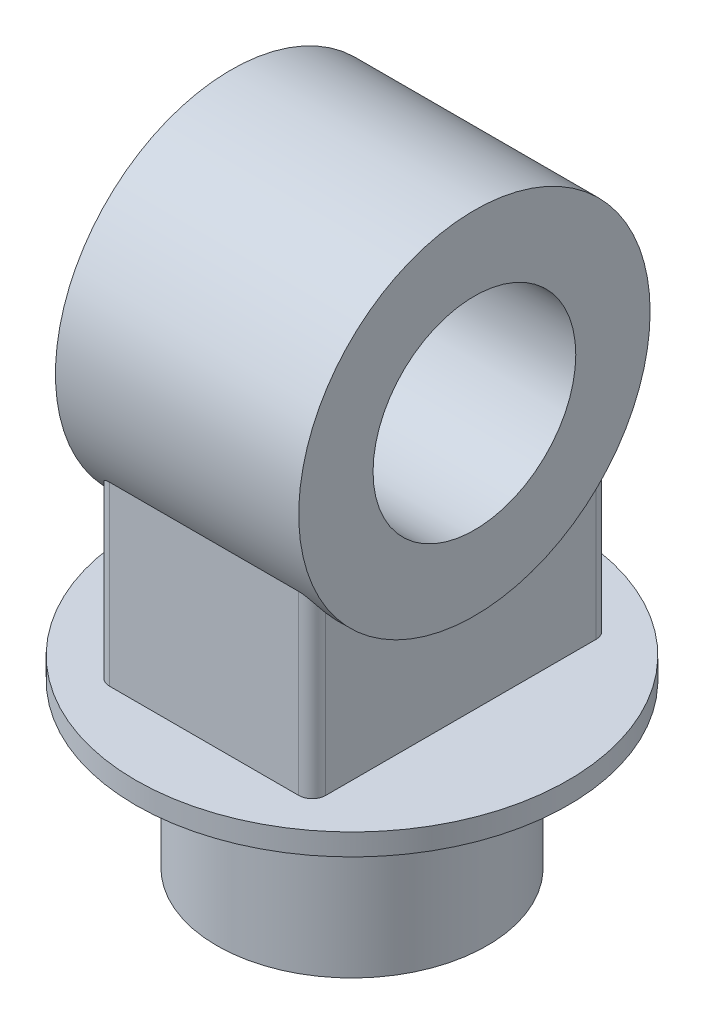
ISO-10303-21;
HEADER;
FILE_DESCRIPTION(('STEP AP214'),'2;1');
FILE_NAME('part.step','',(''),(''),'','','');
FILE_SCHEMA(('AUTOMOTIVE_DESIGN { 1 0 10303 214 1 1 1 1 }'));
ENDSEC;
DATA;
#1=APPLICATION_CONTEXT('core data for automotive mechanical design processes');
#2=APPLICATION_PROTOCOL_DEFINITION('international standard','automotive_design',2000,#1);
#3=PRODUCT_CONTEXT('',#1,'mechanical');
#4=PRODUCT('Part','Part','',(#3));
#5=PRODUCT_RELATED_PRODUCT_CATEGORY('part','',(#4));
#6=PRODUCT_DEFINITION_FORMATION('','',#4);
#7=PRODUCT_DEFINITION_CONTEXT('part definition',#1,'design');
#8=PRODUCT_DEFINITION('design','',#6,#7);
#9=PRODUCT_DEFINITION_SHAPE('','',#8);
#10=(LENGTH_UNIT() NAMED_UNIT(*) SI_UNIT(.MILLI.,.METRE.));
#11=(NAMED_UNIT(*) PLANE_ANGLE_UNIT() SI_UNIT($,.RADIAN.));
#12=(NAMED_UNIT(*) SI_UNIT($,.STERADIAN.) SOLID_ANGLE_UNIT());
#13=UNCERTAINTY_MEASURE_WITH_UNIT(LENGTH_MEASURE(1.E-05),#10,'distance_accuracy_value','');
#14=(GEOMETRIC_REPRESENTATION_CONTEXT(3) GLOBAL_UNCERTAINTY_ASSIGNED_CONTEXT((#13)) GLOBAL_UNIT_ASSIGNED_CONTEXT((#10,
#11,#12)) REPRESENTATION_CONTEXT('',''));
#15=CARTESIAN_POINT('',(0.,0.,0.));
#16=DIRECTION('',(0.,0.,1.));
#17=DIRECTION('',(1.,0.,0.));
#18=AXIS2_PLACEMENT_3D('',#15,#16,#17);
#19=CARTESIAN_POINT('',(80.,216.,-110.576839132589));
#20=DIRECTION('',(0.,0.,1.));
#21=DIRECTION('',(0.,-1.,0.));
#22=AXIS2_PLACEMENT_3D('',#19,#20,#21);
#23=PLANE('',#22);
#24=DIRECTION('',(-1.,0.,0.));
#25=VECTOR('',#24,1.);
#26=CARTESIAN_POINT('',(80.,16.,-110.576839132589));
#27=LINE('',#26,#25);
#28=CARTESIAN_POINT('',(70.,16.,-110.576839132589));
#29=VERTEX_POINT('',#28);
#30=CARTESIAN_POINT('',(-70.,16.,-110.576839132589));
#31=VERTEX_POINT('',#30);
#32=EDGE_CURVE('E205',#29,#31,#27,.T.);
#33=ORIENTED_EDGE('',*,*,#32,.T.);
#34=DIRECTION('',(0.,1.,0.));
#35=VECTOR('',#34,1.);
#36=CARTESIAN_POINT('',(-70.,216.,-110.576839132589));
#37=LINE('',#36,#35);
#38=CARTESIAN_POINT('',(-70.,146.717967697245,-110.576839132589));
#39=VERTEX_POINT('',#38);
#40=EDGE_CURVE('E129',#31,#39,#37,.T.);
#41=ORIENTED_EDGE('',*,*,#40,.T.);
#42=DIRECTION('',(-1.,0.,0.));
#43=VECTOR('',#42,1.);
#44=CARTESIAN_POINT('',(90.,146.717967697245,-110.576839132589));
#45=LINE('',#44,#43);
#46=CARTESIAN_POINT('',(70.,146.717967697245,-110.576839132589));
#47=VERTEX_POINT('',#46);
#48=EDGE_CURVE('E113',#47,#39,#45,.T.);
#49=ORIENTED_EDGE('',*,*,#48,.F.);
#50=DIRECTION('',(0.,1.,0.));
#51=VECTOR('',#50,1.);
#52=CARTESIAN_POINT('',(70.,16.,-110.576839132589));
#53=LINE('',#52,#51);
#54=EDGE_CURVE('E130',#47,#29,#53,.F.);
#55=ORIENTED_EDGE('',*,*,#54,.T.);
#56=EDGE_LOOP('',(#33,#41,#49,#55));
#57=FACE_BOUND('',#56,.T.);
#58=ADVANCED_FACE('F39',(#57),#23,.F.);
#59=CARTESIAN_POINT('',(80.,216.,109.423160867411));
#60=DIRECTION('',(0.,0.,-1.));
#61=DIRECTION('',(0.,1.,0.));
#62=AXIS2_PLACEMENT_3D('',#59,#60,#61);
#63=PLANE('',#62);
#64=DIRECTION('',(-1.,0.,0.));
#65=VECTOR('',#64,1.);
#66=CARTESIAN_POINT('',(90.,146.717967697245,109.423160867411));
#67=LINE('',#66,#65);
#68=CARTESIAN_POINT('',(-70.,146.717967697245,109.423160867411));
#69=VERTEX_POINT('',#68);
#70=CARTESIAN_POINT('',(70.,146.717967697245,109.423160867411));
#71=VERTEX_POINT('',#70);
#72=EDGE_CURVE('E128',#69,#71,#67,.F.);
#73=ORIENTED_EDGE('',*,*,#72,.F.);
#74=DIRECTION('',(0.,-1.,0.));
#75=VECTOR('',#74,1.);
#76=CARTESIAN_POINT('',(-70.,216.,109.423160867411));
#77=LINE('',#76,#75);
#78=CARTESIAN_POINT('',(-70.,16.,109.423160867411));
#79=VERTEX_POINT('',#78);
#80=EDGE_CURVE('E150',#69,#79,#77,.T.);
#81=ORIENTED_EDGE('',*,*,#80,.T.);
#82=DIRECTION('',(-1.,0.,0.));
#83=VECTOR('',#82,1.);
#84=CARTESIAN_POINT('',(80.,16.,109.423160867411));
#85=LINE('',#84,#83);
#86=CARTESIAN_POINT('',(70.,16.,109.423160867411));
#87=VERTEX_POINT('',#86);
#88=EDGE_CURVE('E193',#87,#79,#85,.T.);
#89=ORIENTED_EDGE('',*,*,#88,.F.);
#90=DIRECTION('',(0.,-1.,0.));
#91=VECTOR('',#90,1.);
#92=CARTESIAN_POINT('',(70.,146.717967697245,109.423160867411));
#93=LINE('',#92,#91);
#94=EDGE_CURVE('E144',#87,#71,#93,.F.);
#95=ORIENTED_EDGE('',*,*,#94,.T.);
#96=EDGE_LOOP('',(#73,#81,#89,#95));
#97=FACE_BOUND('',#96,.T.);
#98=ADVANCED_FACE('F196',(#97),#63,.F.);
#99=CARTESIAN_POINT('',(0.,16.,0.));
#100=DIRECTION('',(0.,1.,0.));
#101=DIRECTION('',(0.,0.,1.));
#102=AXIS2_PLACEMENT_3D('',#99,#100,#101);
#103=PLANE('',#102);
#104=CARTESIAN_POINT('',(0.,16.,0.));
#105=DIRECTION('',(0.,1.,0.));
#106=DIRECTION('',(0.,0.,1.));
#107=AXIS2_PLACEMENT_3D('',#104,#105,#106);
#108=CIRCLE('',#107,160.);
#109=CARTESIAN_POINT('',(0.,16.,160.));
#110=VERTEX_POINT('',#109);
#111=EDGE_CURVE('E214',#110,#110,#108,.T.);
#112=ORIENTED_EDGE('',*,*,#111,.T.);
#113=EDGE_LOOP('',(#112));
#114=FACE_BOUND('',#113,.T.);
#115=DIRECTION('',(0.,0.,-1.));
#116=VECTOR('',#115,1.);
#117=CARTESIAN_POINT('',(80.,16.,109.423160867411));
#118=LINE('',#117,#116);
#119=CARTESIAN_POINT('',(80.,16.,99.4231608674106));
#120=VERTEX_POINT('',#119);
#121=CARTESIAN_POINT('',(80.,16.,-100.576839132589));
#122=VERTEX_POINT('',#121);
#123=EDGE_CURVE('E194',#120,#122,#118,.T.);
#124=ORIENTED_EDGE('',*,*,#123,.F.);
#125=CARTESIAN_POINT('',(70.,16.,99.4231608674106));
#126=DIRECTION('',(0.,1.,0.));
#127=DIRECTION('',(0.,0.,1.));
#128=AXIS2_PLACEMENT_3D('',#125,#126,#127);
#129=CIRCLE('',#128,10.);
#130=EDGE_CURVE('E52',#120,#87,#129,.F.);
#131=ORIENTED_EDGE('',*,*,#130,.T.);
#132=ORIENTED_EDGE('',*,*,#88,.T.);
#133=CARTESIAN_POINT('',(-70.,16.,99.4231608674106));
#134=DIRECTION('',(0.,1.,0.));
#135=DIRECTION('',(0.,0.,1.));
#136=AXIS2_PLACEMENT_3D('',#133,#134,#135);
#137=CIRCLE('',#136,10.);
#138=CARTESIAN_POINT('',(-80.,16.,99.4231608674106));
#139=VERTEX_POINT('',#138);
#140=EDGE_CURVE('E183',#79,#139,#137,.F.);
#141=ORIENTED_EDGE('',*,*,#140,.T.);
#142=DIRECTION('',(0.,0.,-1.));
#143=VECTOR('',#142,1.);
#144=CARTESIAN_POINT('',(-80.,16.,109.423160867411));
#145=LINE('',#144,#143);
#146=CARTESIAN_POINT('',(-80.,16.,-100.576839132589));
#147=VERTEX_POINT('',#146);
#148=EDGE_CURVE('E210',#139,#147,#145,.T.);
#149=ORIENTED_EDGE('',*,*,#148,.T.);
#150=CARTESIAN_POINT('',(-70.,16.,-100.576839132589));
#151=DIRECTION('',(0.,1.,0.));
#152=DIRECTION('',(0.,0.,1.));
#153=AXIS2_PLACEMENT_3D('',#150,#151,#152);
#154=CIRCLE('',#153,10.);
#155=EDGE_CURVE('E161',#147,#31,#154,.F.);
#156=ORIENTED_EDGE('',*,*,#155,.T.);
#157=ORIENTED_EDGE('',*,*,#32,.F.);
#158=CARTESIAN_POINT('',(70.,16.,-100.576839132589));
#159=DIRECTION('',(0.,1.,0.));
#160=DIRECTION('',(0.,0.,1.));
#161=AXIS2_PLACEMENT_3D('',#158,#159,#160);
#162=CIRCLE('',#161,10.);
#163=EDGE_CURVE('E58',#29,#122,#162,.F.);
#164=ORIENTED_EDGE('',*,*,#163,.T.);
#165=EDGE_LOOP('',(#124,#131,#132,#141,#149,#156,#157,#164));
#166=FACE_BOUND('',#165,.T.);
#167=ADVANCED_FACE('F192',(#114,#166),#103,.T.);
#168=CARTESIAN_POINT('',(0.,-120.,0.));
#169=DIRECTION('',(0.,1.,0.));
#170=DIRECTION('',(0.,0.,1.));
#171=AXIS2_PLACEMENT_3D('',#168,#169,#170);
#172=CYLINDRICAL_SURFACE('',#171,100.);
#173=CARTESIAN_POINT('',(0.,-120.,0.));
#174=DIRECTION('',(0.,1.,0.));
#175=DIRECTION('',(0.,0.,1.));
#176=AXIS2_PLACEMENT_3D('',#173,#174,#175);
#177=CIRCLE('',#176,100.);
#178=CARTESIAN_POINT('',(0.,-120.,100.));
#179=VERTEX_POINT('',#178);
#180=EDGE_CURVE('E137',#179,#179,#177,.T.);
#181=ORIENTED_EDGE('',*,*,#180,.T.);
#182=EDGE_LOOP('',(#181));
#183=FACE_BOUND('',#182,.T.);
#184=CARTESIAN_POINT('',(0.,0.,0.));
#185=DIRECTION('',(0.,1.,0.));
#186=DIRECTION('',(0.,0.,1.));
#187=AXIS2_PLACEMENT_3D('',#184,#185,#186);
#188=CIRCLE('',#187,100.);
#189=CARTESIAN_POINT('',(0.,0.,100.));
#190=VERTEX_POINT('',#189);
#191=EDGE_CURVE('E217',#190,#190,#188,.T.);
#192=ORIENTED_EDGE('',*,*,#191,.F.);
#193=EDGE_LOOP('',(#192));
#194=FACE_BOUND('',#193,.T.);
#195=ADVANCED_FACE('F173',(#183,#194),#172,.T.);
#196=CARTESIAN_POINT('',(0.,-120.,0.));
#197=DIRECTION('',(0.,1.,0.));
#198=DIRECTION('',(0.,0.,1.));
#199=AXIS2_PLACEMENT_3D('',#196,#197,#198);
#200=PLANE('',#199);
#201=ORIENTED_EDGE('',*,*,#180,.F.);
#202=EDGE_LOOP('',(#201));
#203=FACE_BOUND('',#202,.T.);
#204=ADVANCED_FACE('F228',(#203),#200,.F.);
#205=CARTESIAN_POINT('',(0.,16.,0.));
#206=DIRECTION('',(0.,-1.,0.));
#207=DIRECTION('',(0.,0.,-1.));
#208=AXIS2_PLACEMENT_3D('',#205,#206,#207);
#209=CYLINDRICAL_SURFACE('',#208,160.);
#210=ORIENTED_EDGE('',*,*,#111,.F.);
#211=EDGE_LOOP('',(#210));
#212=FACE_BOUND('',#211,.T.);
#213=CARTESIAN_POINT('',(0.,0.,0.));
#214=DIRECTION('',(0.,1.,0.));
#215=DIRECTION('',(0.,0.,1.));
#216=AXIS2_PLACEMENT_3D('',#213,#214,#215);
#217=CIRCLE('',#216,160.);
#218=CARTESIAN_POINT('',(0.,0.,160.));
#219=VERTEX_POINT('',#218);
#220=EDGE_CURVE('E203',#219,#219,#217,.T.);
#221=ORIENTED_EDGE('',*,*,#220,.T.);
#222=EDGE_LOOP('',(#221));
#223=FACE_BOUND('',#222,.T.);
#224=ADVANCED_FACE('F233',(#212,#223),#209,.T.);
#225=CARTESIAN_POINT('',(0.,0.,0.));
#226=DIRECTION('',(0.,1.,0.));
#227=DIRECTION('',(0.,0.,1.));
#228=AXIS2_PLACEMENT_3D('',#225,#226,#227);
#229=PLANE('',#228);
#230=ORIENTED_EDGE('',*,*,#191,.T.);
#231=EDGE_LOOP('',(#230));
#232=FACE_BOUND('',#231,.T.);
#233=ORIENTED_EDGE('',*,*,#220,.F.);
#234=EDGE_LOOP('',(#233));
#235=FACE_BOUND('',#234,.T.);
#236=ADVANCED_FACE('F223',(#232,#235),#229,.F.);
#237=CARTESIAN_POINT('',(80.,0.,0.));
#238=DIRECTION('',(1.,0.,0.));
#239=DIRECTION('',(0.,0.,-1.));
#240=AXIS2_PLACEMENT_3D('',#237,#238,#239);
#241=PLANE('',#240);
#242=ORIENTED_EDGE('',*,*,#123,.T.);
#243=DIRECTION('',(0.,1.,0.));
#244=VECTOR('',#243,1.);
#245=CARTESIAN_POINT('',(80.,146.717967697245,-100.576839132589));
#246=LINE('',#245,#244);
#247=CARTESIAN_POINT('',(80.,132.933761370819,-100.576839132589));
#248=VERTEX_POINT('',#247);
#249=EDGE_CURVE('E155',#122,#248,#246,.T.);
#250=ORIENTED_EDGE('',*,*,#249,.T.);
#251=CARTESIAN_POINT('',(80.,216.,-0.576839132589393));
#252=DIRECTION('',(1.,0.,0.));
#253=DIRECTION('',(0.,0.,-1.));
#254=AXIS2_PLACEMENT_3D('',#251,#252,#253);
#255=CIRCLE('',#254,130.);
#256=CARTESIAN_POINT('',(80.,132.933761370819,99.4231608674106));
#257=VERTEX_POINT('',#256);
#258=EDGE_CURVE('E116',#248,#257,#255,.F.);
#259=ORIENTED_EDGE('',*,*,#258,.T.);
#260=DIRECTION('',(0.,-1.,0.));
#261=VECTOR('',#260,1.);
#262=CARTESIAN_POINT('',(80.,16.,99.4231608674106));
#263=LINE('',#262,#261);
#264=EDGE_CURVE('E147',#257,#120,#263,.T.);
#265=ORIENTED_EDGE('',*,*,#264,.T.);
#266=EDGE_LOOP('',(#242,#250,#259,#265));
#267=FACE_BOUND('',#266,.T.);
#268=ADVANCED_FACE('F206',(#267),#241,.T.);
#269=CARTESIAN_POINT('',(-80.,0.,0.));
#270=DIRECTION('',(1.,0.,0.));
#271=DIRECTION('',(0.,0.,-1.));
#272=AXIS2_PLACEMENT_3D('',#269,#270,#271);
#273=PLANE('',#272);
#274=CARTESIAN_POINT('',(-80.,216.,-0.576839132589393));
#275=DIRECTION('',(1.,0.,0.));
#276=DIRECTION('',(0.,0.,-1.));
#277=AXIS2_PLACEMENT_3D('',#274,#275,#276);
#278=CIRCLE('',#277,130.);
#279=CARTESIAN_POINT('',(-80.,132.933761370819,-100.576839132589));
#280=VERTEX_POINT('',#279);
#281=CARTESIAN_POINT('',(-80.,132.933761370819,99.4231608674106));
#282=VERTEX_POINT('',#281);
#283=EDGE_CURVE('E135',#280,#282,#278,.F.);
#284=ORIENTED_EDGE('',*,*,#283,.F.);
#285=DIRECTION('',(0.,1.,0.));
#286=VECTOR('',#285,1.);
#287=CARTESIAN_POINT('',(-80.,0.,-100.576839132589));
#288=LINE('',#287,#286);
#289=EDGE_CURVE('E141',#280,#147,#288,.F.);
#290=ORIENTED_EDGE('',*,*,#289,.T.);
#291=ORIENTED_EDGE('',*,*,#148,.F.);
#292=DIRECTION('',(0.,-1.,0.));
#293=VECTOR('',#292,1.);
#294=CARTESIAN_POINT('',(-80.,0.,99.4231608674106));
#295=LINE('',#294,#293);
#296=EDGE_CURVE('E132',#139,#282,#295,.F.);
#297=ORIENTED_EDGE('',*,*,#296,.T.);
#298=EDGE_LOOP('',(#284,#290,#291,#297));
#299=FACE_BOUND('',#298,.T.);
#300=ADVANCED_FACE('F323',(#299),#273,.F.);
#301=CARTESIAN_POINT('',(90.,216.,-0.576839132589393));
#302=DIRECTION('',(-1.,0.,0.));
#303=DIRECTION('',(0.,0.,1.));
#304=AXIS2_PLACEMENT_3D('',#301,#302,#303);
#305=CYLINDRICAL_SURFACE('',#304,130.);
#306=ORIENTED_EDGE('',*,*,#258,.F.);
#307=CARTESIAN_POINT('',(80.,132.933761370819,-100.576839132589));
#308=CARTESIAN_POINT('',(79.9999830665315,133.202952503255,-100.800450284504));
#309=CARTESIAN_POINT('',(79.9924995885085,133.473036166024,-101.022957492646));
#310=CARTESIAN_POINT('',(79.9629173131463,134.014496760122,-101.465387875085));
#311=CARTESIAN_POINT('',(79.9408192370116,134.285873626978,-101.685311176349));
#312=CARTESIAN_POINT('',(79.8822979337703,134.829711400373,-102.122425422661));
#313=CARTESIAN_POINT('',(79.8458612385231,135.102173087004,-102.33961360012));
#314=CARTESIAN_POINT('',(79.7588609087488,135.647413797012,-102.770688166057));
#315=CARTESIAN_POINT('',(79.7082970735217,135.920192824843,-102.984574507583));
#316=CARTESIAN_POINT('',(79.5343891784366,136.74400885936,-103.625247187684));
#317=CARTESIAN_POINT('',(79.3894263280958,137.294974230618,-104.046587500661));
#318=CARTESIAN_POINT('',(79.1288060997198,138.117224843771,-104.665221357267));
#319=CARTESIAN_POINT('',(79.0347525474725,138.39057162742,-104.869176167517));
#320=CARTESIAN_POINT('',(78.8319429710982,138.935304765081,-105.272337835233));
#321=CARTESIAN_POINT('',(78.7231883289499,139.206691300842,-105.471545136921));
#322=CARTESIAN_POINT('',(78.4620472638272,139.812965668139,-105.913009404353));
#323=CARTESIAN_POINT('',(78.3055009036513,140.147108038148,-106.153845673667));
#324=CARTESIAN_POINT('',(77.967808626391,140.809343252621,-106.62650008246));
#325=CARTESIAN_POINT('',(77.7866625854443,141.137436066616,-106.858318176525));
#326=CARTESIAN_POINT('',(77.3986376161628,141.784259610706,-107.310991396623));
#327=CARTESIAN_POINT('',(77.1918317878757,142.103013877599,-107.531875266958));
#328=CARTESIAN_POINT('',(76.749894392022,142.728803605627,-107.961547457712));
#329=CARTESIAN_POINT('',(76.5147746155492,143.035843875289,-108.170340759865));
#330=CARTESIAN_POINT('',(76.1068757916445,143.522080966667,-108.498118147998));
#331=CARTESIAN_POINT('',(75.9435605188263,143.706240813683,-108.621549017307));
#332=CARTESIAN_POINT('',(75.6038296157538,144.066582834907,-108.861788799522));
#333=CARTESIAN_POINT('',(75.4274174262628,144.242767084986,-108.978599437545));
#334=CARTESIAN_POINT('',(75.0605773993746,144.585236991633,-109.204522874577));
#335=CARTESIAN_POINT('',(74.8701521613912,144.751524473746,-109.313637093951));
#336=CARTESIAN_POINT('',(74.4745306992528,145.071634412635,-109.522713543021));
#337=CARTESIAN_POINT('',(74.2693395369045,145.225461102935,-109.622678882539));
#338=CARTESIAN_POINT('',(73.7536743100227,145.579056080623,-109.85149951874));
#339=CARTESIAN_POINT('',(73.4351396850742,145.771031349643,-109.974885495406));
#340=CARTESIAN_POINT('',(72.9345418523036,146.026263049992,-110.138175589797));
#341=CARTESIAN_POINT('',(72.7641622498837,146.105785634321,-110.188911401984));
#342=CARTESIAN_POINT('',(72.4160328323222,146.25239837099,-110.282260980186));
#343=CARTESIAN_POINT('',(72.2382876769633,146.319496241142,-110.32487978868));
#344=CARTESIAN_POINT('',(71.8947331689276,146.433384610412,-110.39710187659));
#345=CARTESIAN_POINT('',(71.729567610939,146.481551609067,-110.427591445356));
#346=CARTESIAN_POINT('',(71.3948451418076,146.565274678987,-110.480530496217));
#347=CARTESIAN_POINT('',(71.2252897238033,146.600834979285,-110.502982674554));
#348=CARTESIAN_POINT('',(70.8807814271977,146.658707696818,-110.539498175367));
#349=CARTESIAN_POINT('',(70.7057875562757,146.680848750137,-110.553452996622));
#350=CARTESIAN_POINT('',(70.4419386674803,146.703076138542,-110.567458779209));
#351=CARTESIAN_POINT('',(70.3536902139711,146.708654625171,-110.57097299751));
#352=CARTESIAN_POINT('',(70.1769662160102,146.716102079046,-110.575664122082));
#353=CARTESIAN_POINT('',(70.088490649507,146.717970671296,-110.576840792075));
#354=CARTESIAN_POINT('',(70.,146.717967697245,-110.576839132589));
#355=B_SPLINE_CURVE_WITH_KNOTS('',3,(#307,#308,#309,#310,#311,#312,#313,#314,#315,#316,#317,
#318,#319,#320,#321,#322,#323,#324,#325,#326,#327,#328,#329,#330,#331,#332,#333,#334,#335,#336,
#337,#338,#339,#340,#341,#342,#343,#344,#345,#346,#347,#348,#349,#350,#351,#352,#353,#354),
.UNSPECIFIED.,.F.,.F.,(4,2,2,2,2,2,2,2,2,2,2,2,2,2,2,2,2,2,2,2,2,2,2,4),(0.,1.04974156507776,
2.09943133114567,3.15010942417265,4.20080244462027,6.32356278933856,7.38465211465328,
8.44564176134497,9.76677685539396,11.087918601761,12.4053795382948,13.7222937149077,
14.5479419827464,15.3733741023698,16.1986534888326,17.023651302289,18.194686650492,
18.7783719827905,19.3616935243415,19.8852298594992,20.4085904030381,20.9385006934629,
21.2038887699912,21.4693036704869),.UNSPECIFIED.);
#356=EDGE_CURVE('E112',#248,#47,#355,.T.);
#357=ORIENTED_EDGE('',*,*,#356,.T.);
#358=ORIENTED_EDGE('',*,*,#48,.T.);
#359=CARTESIAN_POINT('',(-70.,146.717967697245,-110.576839132589));
#360=CARTESIAN_POINT('',(-70.1614230595313,146.718025852698,-110.576872816051));
#361=CARTESIAN_POINT('',(-70.3228118197691,146.711764254296,-110.572931925003));
#362=CARTESIAN_POINT('',(-70.6441123999958,146.687045880384,-110.557359115368));
#363=CARTESIAN_POINT('',(-70.8040256031146,146.668602027069,-110.545735346302));
#364=CARTESIAN_POINT('',(-71.1196424551221,146.620217986395,-110.515215531543));
#365=CARTESIAN_POINT('',(-71.2753727040436,146.590400967593,-110.496397394211));
#366=CARTESIAN_POINT('',(-71.5834085562727,146.52000006118,-110.451910690923));
#367=CARTESIAN_POINT('',(-71.7357130704249,146.479412800404,-110.426239978773));
#368=CARTESIAN_POINT('',(-72.0722520040974,146.377386983169,-110.361611399607));
#369=CARTESIAN_POINT('',(-72.2553511890568,146.313281105856,-110.320942657982));
#370=CARTESIAN_POINT('',(-72.6141464391851,146.17165023193,-110.230879665393));
#371=CARTESIAN_POINT('',(-72.7898371277865,146.094115691273,-110.181479208091));
#372=CARTESIAN_POINT('',(-73.133872391345,145.927147418338,-110.074807938482));
#373=CARTESIAN_POINT('',(-73.302184951541,145.837667562915,-110.017506589629));
#374=CARTESIAN_POINT('',(-73.6304969218558,145.648779195145,-109.896180258751));
#375=CARTESIAN_POINT('',(-73.7904982269664,145.549372961282,-109.83215681953));
#376=CARTESIAN_POINT('',(-74.1868876463209,145.28590129292,-109.661908475844));
#377=CARTESIAN_POINT('',(-74.4176642111939,145.115997241409,-109.551621123158));
#378=CARTESIAN_POINT('',(-74.8607110351426,144.76058359918,-109.319612076246));
#379=CARTESIAN_POINT('',(-75.072970840064,144.575065307649,-109.197884002373));
#380=CARTESIAN_POINT('',(-75.4804206329534,144.19164129378,-108.94478859738));
#381=CARTESIAN_POINT('',(-75.6755852518652,143.993717884812,-108.813407455216));
#382=CARTESIAN_POINT('',(-76.0497203250662,143.588382733388,-108.542653632509));
#383=CARTESIAN_POINT('',(-76.2286920360201,143.380971729107,-108.403281573482));
#384=CARTESIAN_POINT('',(-76.5468161797372,142.989174407744,-108.138295640219));
#385=CARTESIAN_POINT('',(-76.6879854690673,142.805791987749,-108.01360395439));
#386=CARTESIAN_POINT('',(-76.9599552926783,142.434497987953,-107.759708812389));
#387=CARTESIAN_POINT('',(-77.0907543539386,142.24658576965,-107.630504719001));
#388=CARTESIAN_POINT('',(-77.4685356621902,141.677121003612,-107.236683476756));
#389=CARTESIAN_POINT('',(-77.7008024816961,141.289965080353,-106.965941577733));
#390=CARTESIAN_POINT('',(-78.129863631631,140.504836154638,-106.410257327536));
#391=CARTESIAN_POINT('',(-78.3265689888296,140.106838810795,-106.125281574392));
#392=CARTESIAN_POINT('',(-78.6860846955171,139.304344779382,-105.543605420829));
#393=CARTESIAN_POINT('',(-78.8489012287858,138.899849292081,-105.246907171222));
#394=CARTESIAN_POINT('',(-79.1623550419402,138.030646711215,-104.60141364199));
#395=CARTESIAN_POINT('',(-79.3081944572228,137.565348460988,-104.251087891227));
#396=CARTESIAN_POINT('',(-79.558756520093,136.632523338709,-103.538715810542));
#397=CARTESIAN_POINT('',(-79.6634734792563,136.16499616738,-103.176667866596));
#398=CARTESIAN_POINT('',(-79.7891645729387,135.46639720469,-102.627931869412));
#399=CARTESIAN_POINT('',(-79.8257282191264,135.235094848973,-102.444976600754));
#400=CARTESIAN_POINT('',(-79.8886289353229,134.772885500361,-102.076805283205));
#401=CARTESIAN_POINT('',(-79.9149661467555,134.541978502041,-101.891589265615));
#402=CARTESIAN_POINT('',(-79.9572665465168,134.080919722901,-101.519159619102));
#403=CARTESIAN_POINT('',(-79.9732322353467,133.850767773367,-101.331946482743));
#404=CARTESIAN_POINT('',(-79.9945948234744,133.391449185777,-100.955699394753));
#405=CARTESIAN_POINT('',(-79.9999912789888,133.162282589497,-100.766665367001));
#406=CARTESIAN_POINT('',(-80.,132.933761370819,-100.576839132589));
#407=B_SPLINE_CURVE_WITH_KNOTS('',3,(#359,#360,#361,#362,#363,#364,#365,#366,#367,#368,#369,
#370,#371,#372,#373,#374,#375,#376,#377,#378,#379,#380,#381,#382,#383,#384,#385,#386,#387,#388,
#389,#390,#391,#392,#393,#394,#395,#396,#397,#398,#399,#400,#401,#402,#403,#404,#405,#406),
.UNSPECIFIED.,.F.,.F.,(4,2,2,2,2,2,2,2,2,2,2,2,2,2,2,2,2,2,2,2,2,2,2,4),(0.,0.484045005923085,
0.967577389145411,1.44601544684508,1.92460352520314,2.51835043890465,3.11252108624074,
3.70905613988738,4.30545457926271,5.22516595363369,6.14539326092323,7.06696382284188,
7.9884628040196,8.77680092000535,9.56525081419886,11.1426900482286,12.7240229357797,
14.3050670200469,16.1047501551828,17.9046821508917,18.7960435003637,19.6873925225409,
20.5785265668947,21.4696980275819),.UNSPECIFIED.);
#408=EDGE_CURVE('E152',#39,#280,#407,.T.);
#409=ORIENTED_EDGE('',*,*,#408,.T.);
#410=ORIENTED_EDGE('',*,*,#283,.T.);
#411=CARTESIAN_POINT('',(-80.,132.933761370819,99.4231608674106));
#412=CARTESIAN_POINT('',(-79.9999830665315,133.202952503255,99.6467720193253));
#413=CARTESIAN_POINT('',(-79.9924995885085,133.473036166024,99.8692792274672));
#414=CARTESIAN_POINT('',(-79.9629173131463,134.014496760122,100.311709609906));
#415=CARTESIAN_POINT('',(-79.9408192370116,134.285873626978,100.53163291117));
#416=CARTESIAN_POINT('',(-79.8822979337703,134.829711400373,100.968747157482));
#417=CARTESIAN_POINT('',(-79.8458612385231,135.102173087004,101.185935334941));
#418=CARTESIAN_POINT('',(-79.7588609087488,135.647413797012,101.617009900878));
#419=CARTESIAN_POINT('',(-79.7082970735217,135.920192824843,101.830896242404));
#420=CARTESIAN_POINT('',(-79.5343891784366,136.74400885936,102.471568922506));
#421=CARTESIAN_POINT('',(-79.3894263280958,137.294974230618,102.892909235483));
#422=CARTESIAN_POINT('',(-79.1288060997198,138.117224843771,103.511543092088));
#423=CARTESIAN_POINT('',(-79.0347525474725,138.39057162742,103.715497902338));
#424=CARTESIAN_POINT('',(-78.8319429710982,138.935304765081,104.118659570054));
#425=CARTESIAN_POINT('',(-78.7231883289499,139.206691300842,104.317866871743));
#426=CARTESIAN_POINT('',(-78.4620472638272,139.812965668139,104.759331139174));
#427=CARTESIAN_POINT('',(-78.3055009036513,140.147108038148,105.000167408488));
#428=CARTESIAN_POINT('',(-77.967808626391,140.809343252621,105.472821817281));
#429=CARTESIAN_POINT('',(-77.7866625854444,141.137436066616,105.704639911346));
#430=CARTESIAN_POINT('',(-77.3986376161628,141.784259610706,106.157313131444));
#431=CARTESIAN_POINT('',(-77.1918317878757,142.103013877598,106.378197001779));
#432=CARTESIAN_POINT('',(-76.749894392022,142.728803605627,106.807869192533));
#433=CARTESIAN_POINT('',(-76.5147746155493,143.035843875289,107.016662494686));
#434=CARTESIAN_POINT('',(-76.1068757916446,143.522080966666,107.344439882819));
#435=CARTESIAN_POINT('',(-75.9435605188263,143.706240813682,107.467870752128));
#436=CARTESIAN_POINT('',(-75.6038296157538,144.066582834907,107.708110534343));
#437=CARTESIAN_POINT('',(-75.4274174262629,144.242767084986,107.824921172366));
#438=CARTESIAN_POINT('',(-75.0605773993746,144.585236991633,108.050844609399));
#439=CARTESIAN_POINT('',(-74.8701521613913,144.751524473746,108.159958828772));
#440=CARTESIAN_POINT('',(-74.4745306992528,145.071634412635,108.369035277842));
#441=CARTESIAN_POINT('',(-74.2693395369045,145.225461102935,108.46900061736));
#442=CARTESIAN_POINT('',(-73.7536743100227,145.579056080623,108.697821253562));
#443=CARTESIAN_POINT('',(-73.4351396850742,145.771031349643,108.821207230227));
#444=CARTESIAN_POINT('',(-72.9345418523036,146.026263049992,108.984497324618));
#445=CARTESIAN_POINT('',(-72.7641622498837,146.105785634321,109.035233136806));
#446=CARTESIAN_POINT('',(-72.4160328323223,146.25239837099,109.128582715008));
#447=CARTESIAN_POINT('',(-72.2382876769633,146.319496241142,109.171201523501));
#448=CARTESIAN_POINT('',(-71.8947331689276,146.433384610412,109.243423611412));
#449=CARTESIAN_POINT('',(-71.729567610939,146.481551609067,109.273913180178));
#450=CARTESIAN_POINT('',(-71.3948451418076,146.565274678987,109.326852231039));
#451=CARTESIAN_POINT('',(-71.2252897238033,146.600834979285,109.349304409375));
#452=CARTESIAN_POINT('',(-70.8807814271977,146.658707696818,109.385819910188));
#453=CARTESIAN_POINT('',(-70.7057875562757,146.680848750137,109.399774731443));
#454=CARTESIAN_POINT('',(-70.4419386674803,146.703076138542,109.413780514031));
#455=CARTESIAN_POINT('',(-70.3536902139711,146.708654625171,109.417294732331));
#456=CARTESIAN_POINT('',(-70.1769662160102,146.716102079046,109.421985856903));
#457=CARTESIAN_POINT('',(-70.088490649507,146.717970671296,109.423162526896));
#458=CARTESIAN_POINT('',(-70.,146.717967697245,109.423160867411));
#459=B_SPLINE_CURVE_WITH_KNOTS('',3,(#411,#412,#413,#414,#415,#416,#417,#418,#419,#420,#421,
#422,#423,#424,#425,#426,#427,#428,#429,#430,#431,#432,#433,#434,#435,#436,#437,#438,#439,#440,
#441,#442,#443,#444,#445,#446,#447,#448,#449,#450,#451,#452,#453,#454,#455,#456,#457,#458),
.UNSPECIFIED.,.F.,.F.,(4,2,2,2,2,2,2,2,2,2,2,2,2,2,2,2,2,2,2,2,2,2,2,4),(0.,1.0497415650778,
2.09943133114571,3.15010942417265,4.20080244462028,6.32356278933853,7.38465211465325,
8.44564176134495,9.76677685539393,11.0879186017609,12.4053795382948,13.7222937149077,
14.5479419827464,15.3733741023698,16.1986534888326,17.023651302289,18.1946866504919,
18.7783719827905,19.3616935243415,19.8852298594992,20.408590403038,20.9385006934629,
21.2038887699912,21.4693036704869),.UNSPECIFIED.);
#460=EDGE_CURVE('E125',#282,#69,#459,.T.);
#461=ORIENTED_EDGE('',*,*,#460,.T.);
#462=ORIENTED_EDGE('',*,*,#72,.T.);
#463=CARTESIAN_POINT('',(70.,146.717967697245,109.423160867411));
#464=CARTESIAN_POINT('',(70.1614230595313,146.718025852698,109.423194550872));
#465=CARTESIAN_POINT('',(70.3228118197691,146.711764254296,109.419253659824));
#466=CARTESIAN_POINT('',(70.6441123999957,146.687045880384,109.403680850189));
#467=CARTESIAN_POINT('',(70.8040256031146,146.668602027069,109.392057081123));
#468=CARTESIAN_POINT('',(71.1196424551221,146.620217986395,109.361537266364));
#469=CARTESIAN_POINT('',(71.2753727040436,146.590400967593,109.342719129033));
#470=CARTESIAN_POINT('',(71.5834085562726,146.52000006118,109.298232425744));
#471=CARTESIAN_POINT('',(71.7357130704249,146.479412800404,109.272561713595));
#472=CARTESIAN_POINT('',(72.0722520040974,146.377386983169,109.207933134428));
#473=CARTESIAN_POINT('',(72.2553511890568,146.313281105856,109.167264392803));
#474=CARTESIAN_POINT('',(72.6141464391851,146.17165023193,109.077201400214));
#475=CARTESIAN_POINT('',(72.7898371277864,146.094115691273,109.027800942912));
#476=CARTESIAN_POINT('',(73.133872391345,145.927147418338,108.921129673303));
#477=CARTESIAN_POINT('',(73.302184951541,145.837667562915,108.86382832445));
#478=CARTESIAN_POINT('',(73.6304969218558,145.648779195145,108.742501993572));
#479=CARTESIAN_POINT('',(73.7904982269664,145.549372961282,108.678478554351));
#480=CARTESIAN_POINT('',(74.1868876463209,145.28590129292,108.508230210665));
#481=CARTESIAN_POINT('',(74.4176642111939,145.115997241409,108.397942857979));
#482=CARTESIAN_POINT('',(74.8607110351426,144.76058359918,108.165933811067));
#483=CARTESIAN_POINT('',(75.072970840064,144.575065307649,108.044205737194));
#484=CARTESIAN_POINT('',(75.4804206329534,144.19164129378,107.791110332201));
#485=CARTESIAN_POINT('',(75.6755852518652,143.993717884812,107.659729190037));
#486=CARTESIAN_POINT('',(76.0497203250661,143.588382733387,107.38897536733));
#487=CARTESIAN_POINT('',(76.2286920360201,143.380971729107,107.249603308303));
#488=CARTESIAN_POINT('',(76.5468161797372,142.989174407744,106.98461737504));
#489=CARTESIAN_POINT('',(76.6879854690673,142.805791987749,106.859925689211));
#490=CARTESIAN_POINT('',(76.9599552926783,142.434497987953,106.60603054721));
#491=CARTESIAN_POINT('',(77.0907543539385,142.24658576965,106.476826453822));
#492=CARTESIAN_POINT('',(77.4685356621901,141.677121003612,106.083005211578));
#493=CARTESIAN_POINT('',(77.700802481696,141.289965080353,105.812263312554));
#494=CARTESIAN_POINT('',(78.1298636316309,140.504836154638,105.256579062357));
#495=CARTESIAN_POINT('',(78.3265689888295,140.106838810795,104.971603309213));
#496=CARTESIAN_POINT('',(78.6860846955171,139.304344779382,104.38992715565));
#497=CARTESIAN_POINT('',(78.8489012287858,138.899849292081,104.093228906043));
#498=CARTESIAN_POINT('',(79.1623550419402,138.030646711215,103.447735376812));
#499=CARTESIAN_POINT('',(79.3081944572228,137.565348460988,103.097409626048));
#500=CARTESIAN_POINT('',(79.558756520093,136.632523338709,102.385037545363));
#501=CARTESIAN_POINT('',(79.6634734792563,136.16499616738,102.022989601417));
#502=CARTESIAN_POINT('',(79.7891645729387,135.46639720469,101.474253604233));
#503=CARTESIAN_POINT('',(79.8257282191264,135.235094848973,101.291298335575));
#504=CARTESIAN_POINT('',(79.8886289353229,134.77288550036,100.923127018027));
#505=CARTESIAN_POINT('',(79.9149661467555,134.541978502041,100.737911000436));
#506=CARTESIAN_POINT('',(79.9572665465168,134.080919722901,100.365481353924));
#507=CARTESIAN_POINT('',(79.9732322353467,133.850767773367,100.178268217564));
#508=CARTESIAN_POINT('',(79.9945948234744,133.391449185777,99.8020211295739));
#509=CARTESIAN_POINT('',(79.9999912789888,133.162282589497,99.6129871018223));
#510=CARTESIAN_POINT('',(80.,132.933761370819,99.4231608674106));
#511=B_SPLINE_CURVE_WITH_KNOTS('',3,(#463,#464,#465,#466,#467,#468,#469,#470,#471,#472,#473,
#474,#475,#476,#477,#478,#479,#480,#481,#482,#483,#484,#485,#486,#487,#488,#489,#490,#491,#492,
#493,#494,#495,#496,#497,#498,#499,#500,#501,#502,#503,#504,#505,#506,#507,#508,#509,#510),
.UNSPECIFIED.,.F.,.F.,(4,2,2,2,2,2,2,2,2,2,2,2,2,2,2,2,2,2,2,2,2,2,2,4),(0.,0.484045005923068,
0.967577389145423,1.44601544684506,1.92460352520313,2.51835043890466,3.11252108624074,
3.70905613988738,4.30545457926271,5.22516595363369,6.14539326092323,7.06696382284188,
7.98846280401958,8.77680092000532,9.56525081419887,11.1426900482286,12.7240229357797,
14.3050670200469,16.1047501551827,17.9046821508917,18.7960435003637,19.6873925225409,
20.5785265668947,21.4696980275819),.UNSPECIFIED.);
#512=EDGE_CURVE('E11',#71,#257,#511,.T.);
#513=ORIENTED_EDGE('',*,*,#512,.T.);
#514=EDGE_LOOP('',(#306,#357,#358,#409,#410,#461,#462,#513));
#515=FACE_BOUND('',#514,.T.);
#516=CARTESIAN_POINT('',(90.,216.,-0.576839132589393));
#517=DIRECTION('',(1.,0.,0.));
#518=DIRECTION('',(0.,0.,-1.));
#519=AXIS2_PLACEMENT_3D('',#516,#517,#518);
#520=CIRCLE('',#519,130.);
#521=CARTESIAN_POINT('',(90.,216.,-130.576839132589));
#522=VERTEX_POINT('',#521);
#523=EDGE_CURVE('E374',#522,#522,#520,.T.);
#524=ORIENTED_EDGE('',*,*,#523,.F.);
#525=EDGE_LOOP('',(#524));
#526=FACE_BOUND('',#525,.T.);
#527=CARTESIAN_POINT('',(-90.,216.,-0.576839132589393));
#528=DIRECTION('',(1.,0.,0.));
#529=DIRECTION('',(0.,0.,-1.));
#530=AXIS2_PLACEMENT_3D('',#527,#528,#529);
#531=CIRCLE('',#530,130.);
#532=CARTESIAN_POINT('',(-90.,216.,-130.576839132589));
#533=VERTEX_POINT('',#532);
#534=EDGE_CURVE('E380',#533,#533,#531,.T.);
#535=ORIENTED_EDGE('',*,*,#534,.T.);
#536=EDGE_LOOP('',(#535));
#537=FACE_BOUND('',#536,.T.);
#538=ADVANCED_FACE('F114',(#515,#526,#537),#305,.T.);
#539=CARTESIAN_POINT('',(90.,216.,-0.576839132589393));
#540=DIRECTION('',(1.,0.,0.));
#541=DIRECTION('',(0.,0.,-1.));
#542=AXIS2_PLACEMENT_3D('',#539,#540,#541);
#543=PLANE('',#542);
#544=CARTESIAN_POINT('',(90.,216.,-0.576839132589393));
#545=DIRECTION('',(1.,0.,0.));
#546=DIRECTION('',(0.,0.,-1.));
#547=AXIS2_PLACEMENT_3D('',#544,#545,#546);
#548=CIRCLE('',#547,75.);
#549=CARTESIAN_POINT('',(90.,216.,-75.5768391325894));
#550=VERTEX_POINT('',#549);
#551=EDGE_CURVE('E382',#550,#550,#548,.T.);
#552=ORIENTED_EDGE('',*,*,#551,.F.);
#553=EDGE_LOOP('',(#552));
#554=FACE_BOUND('',#553,.T.);
#555=ORIENTED_EDGE('',*,*,#523,.T.);
#556=EDGE_LOOP('',(#555));
#557=FACE_BOUND('',#556,.T.);
#558=ADVANCED_FACE('F267',(#554,#557),#543,.T.);
#559=CARTESIAN_POINT('',(-90.,216.,-0.576839132589393));
#560=DIRECTION('',(1.,0.,0.));
#561=DIRECTION('',(0.,0.,-1.));
#562=AXIS2_PLACEMENT_3D('',#559,#560,#561);
#563=PLANE('',#562);
#564=CARTESIAN_POINT('',(-90.,216.,-0.576839132589393));
#565=DIRECTION('',(1.,0.,0.));
#566=DIRECTION('',(0.,0.,-1.));
#567=AXIS2_PLACEMENT_3D('',#564,#565,#566);
#568=CIRCLE('',#567,75.);
#569=CARTESIAN_POINT('',(-90.,216.,-75.5768391325894));
#570=VERTEX_POINT('',#569);
#571=EDGE_CURVE('E381',#570,#570,#568,.T.);
#572=ORIENTED_EDGE('',*,*,#571,.T.);
#573=EDGE_LOOP('',(#572));
#574=FACE_BOUND('',#573,.T.);
#575=ORIENTED_EDGE('',*,*,#534,.F.);
#576=EDGE_LOOP('',(#575));
#577=FACE_BOUND('',#576,.T.);
#578=ADVANCED_FACE('F272',(#574,#577),#563,.F.);
#579=CARTESIAN_POINT('',(-90.,216.,-0.576839132589393));
#580=DIRECTION('',(1.,0.,0.));
#581=DIRECTION('',(0.,0.,-1.));
#582=AXIS2_PLACEMENT_3D('',#579,#580,#581);
#583=CYLINDRICAL_SURFACE('',#582,75.);
#584=CARTESIAN_POINT('',(-90.,216.,-75.5768391325894));
#585=CARTESIAN_POINT('',(-88.125,216.,-75.5768391325894));
#586=CARTESIAN_POINT('',(-86.25,216.,-75.5768391325894));
#587=CARTESIAN_POINT('',(-82.5,216.,-75.5768391325894));
#588=CARTESIAN_POINT('',(-80.625,216.,-75.5768391325894));
#589=CARTESIAN_POINT('',(-76.875,216.,-75.5768391325894));
#590=CARTESIAN_POINT('',(-75.,216.,-75.5768391325894));
#591=CARTESIAN_POINT('',(-71.25,216.,-75.5768391325894));
#592=CARTESIAN_POINT('',(-69.375,216.,-75.5768391325894));
#593=CARTESIAN_POINT('',(-65.625,216.,-75.5768391325894));
#594=CARTESIAN_POINT('',(-63.75,216.,-75.5768391325894));
#595=CARTESIAN_POINT('',(-60.,216.,-75.5768391325894));
#596=CARTESIAN_POINT('',(-58.125,216.,-75.5768391325894));
#597=CARTESIAN_POINT('',(-54.375,216.,-75.5768391325894));
#598=CARTESIAN_POINT('',(-52.5,216.,-75.5768391325894));
#599=CARTESIAN_POINT('',(-48.75,216.,-75.5768391325894));
#600=CARTESIAN_POINT('',(-46.875,216.,-75.5768391325894));
#601=CARTESIAN_POINT('',(-43.125,216.,-75.5768391325894));
#602=CARTESIAN_POINT('',(-41.25,216.,-75.5768391325894));
#603=CARTESIAN_POINT('',(-37.5,216.,-75.5768391325894));
#604=CARTESIAN_POINT('',(-35.625,216.,-75.5768391325894));
#605=CARTESIAN_POINT('',(-31.875,216.,-75.5768391325894));
#606=CARTESIAN_POINT('',(-30.,216.,-75.5768391325894));
#607=CARTESIAN_POINT('',(-26.25,216.,-75.5768391325894));
#608=CARTESIAN_POINT('',(-24.375,216.,-75.5768391325894));
#609=CARTESIAN_POINT('',(-20.625,216.,-75.5768391325894));
#610=CARTESIAN_POINT('',(-18.75,216.,-75.5768391325894));
#611=CARTESIAN_POINT('',(-15.,216.,-75.5768391325894));
#612=CARTESIAN_POINT('',(-13.125,216.,-75.5768391325894));
#613=CARTESIAN_POINT('',(-9.37500000000003,216.,-75.5768391325894));
#614=CARTESIAN_POINT('',(-7.50000000000003,216.,-75.5768391325894));
#615=CARTESIAN_POINT('',(-3.75000000000003,216.,-75.5768391325894));
#616=CARTESIAN_POINT('',(-1.87500000000003,216.,-75.5768391325894));
#617=CARTESIAN_POINT('',(1.87499999999997,216.,-75.5768391325894));
#618=CARTESIAN_POINT('',(3.74999999999998,216.,-75.5768391325894));
#619=CARTESIAN_POINT('',(7.49999999999997,216.,-75.5768391325894));
#620=CARTESIAN_POINT('',(9.37499999999997,216.,-75.5768391325894));
#621=CARTESIAN_POINT('',(13.125,216.,-75.5768391325894));
#622=CARTESIAN_POINT('',(15.,216.,-75.5768391325894));
#623=CARTESIAN_POINT('',(18.75,216.,-75.5768391325894));
#624=CARTESIAN_POINT('',(20.625,216.,-75.5768391325894));
#625=CARTESIAN_POINT('',(24.375,216.,-75.5768391325894));
#626=CARTESIAN_POINT('',(26.25,216.,-75.5768391325894));
#627=CARTESIAN_POINT('',(30.,216.,-75.5768391325894));
#628=CARTESIAN_POINT('',(31.875,216.,-75.5768391325894));
#629=CARTESIAN_POINT('',(35.625,216.,-75.5768391325894));
#630=CARTESIAN_POINT('',(37.5,216.,-75.5768391325894));
#631=CARTESIAN_POINT('',(41.25,216.,-75.5768391325894));
#632=CARTESIAN_POINT('',(43.125,216.,-75.5768391325894));
#633=CARTESIAN_POINT('',(46.875,216.,-75.5768391325894));
#634=CARTESIAN_POINT('',(48.75,216.,-75.5768391325894));
#635=CARTESIAN_POINT('',(52.5,216.,-75.5768391325894));
#636=CARTESIAN_POINT('',(54.375,216.,-75.5768391325894));
#637=CARTESIAN_POINT('',(58.125,216.,-75.5768391325894));
#638=CARTESIAN_POINT('',(60.,216.,-75.5768391325894));
#639=CARTESIAN_POINT('',(63.75,216.,-75.5768391325894));
#640=CARTESIAN_POINT('',(65.625,216.,-75.5768391325894));
#641=CARTESIAN_POINT('',(69.375,216.,-75.5768391325894));
#642=CARTESIAN_POINT('',(71.25,216.,-75.5768391325894));
#643=CARTESIAN_POINT('',(75.,216.,-75.5768391325894));
#644=CARTESIAN_POINT('',(76.875,216.,-75.5768391325894));
#645=CARTESIAN_POINT('',(80.625,216.,-75.5768391325894));
#646=CARTESIAN_POINT('',(82.5,216.,-75.5768391325894));
#647=CARTESIAN_POINT('',(86.25,216.,-75.5768391325894));
#648=CARTESIAN_POINT('',(88.125,216.,-75.5768391325894));
#649=CARTESIAN_POINT('',(90.,216.,-75.5768391325894));
#650=B_SPLINE_CURVE_WITH_KNOTS('',3,(#584,#585,#586,#587,#588,#589,#590,#591,#592,#593,#594,
#595,#596,#597,#598,#599,#600,#601,#602,#603,#604,#605,#606,#607,#608,#609,#610,#611,#612,#613,
#614,#615,#616,#617,#618,#619,#620,#621,#622,#623,#624,#625,#626,#627,#628,#629,#630,#631,#632,
#633,#634,#635,#636,#637,#638,#639,#640,#641,#642,#643,#644,#645,#646,#647,#648,#649),
.UNSPECIFIED.,.F.,.F.,(4,2,2,2,2,2,2,2,2,2,2,2,2,2,2,2,2,2,2,2,2,2,2,2,2,2,2,2,2,2,2,2,4),(0.,
5.62500000000001,11.25,16.875,22.5,28.125,33.75,39.375,45.,50.625,56.25,61.875,67.5,73.125,
78.75,84.375,90.,95.625,101.25,106.875,112.5,118.125,123.75,129.375,135.,140.625,146.25,151.875,
157.5,163.125,168.75,174.375,180.),.UNSPECIFIED.);
#651=EDGE_CURVE('BSEAM171',#570,#550,#650,.T.);
#652=ORIENTED_EDGE('',*,*,#571,.F.);
#653=ORIENTED_EDGE('',*,*,#551,.T.);
#654=ORIENTED_EDGE('',*,*,#651,.T.);
#655=ORIENTED_EDGE('',*,*,#651,.F.);
#656=EDGE_LOOP('',(#652,#654,#653,#655));
#657=FACE_BOUND('',#656,.T.);
#658=ADVANCED_FACE('F171',(#657),#583,.F.);
#659=CARTESIAN_POINT('',(-70.,216.,-100.576839132589));
#660=DIRECTION('',(0.,1.,0.));
#661=DIRECTION('',(0.,0.,1.));
#662=AXIS2_PLACEMENT_3D('',#659,#660,#661);
#663=CYLINDRICAL_SURFACE('',#662,10.);
#664=ORIENTED_EDGE('',*,*,#155,.F.);
#665=ORIENTED_EDGE('',*,*,#289,.F.);
#666=ORIENTED_EDGE('',*,*,#408,.F.);
#667=ORIENTED_EDGE('',*,*,#40,.F.);
#668=EDGE_LOOP('',(#664,#665,#666,#667));
#669=FACE_BOUND('',#668,.T.);
#670=ADVANCED_FACE('F167',(#669),#663,.T.);
#671=CARTESIAN_POINT('',(-70.,216.,99.4231608674106));
#672=DIRECTION('',(0.,-1.,0.));
#673=DIRECTION('',(0.,0.,-1.));
#674=AXIS2_PLACEMENT_3D('',#671,#672,#673);
#675=CYLINDRICAL_SURFACE('',#674,10.);
#676=ORIENTED_EDGE('',*,*,#460,.F.);
#677=ORIENTED_EDGE('',*,*,#296,.F.);
#678=ORIENTED_EDGE('',*,*,#140,.F.);
#679=ORIENTED_EDGE('',*,*,#80,.F.);
#680=EDGE_LOOP('',(#676,#677,#678,#679));
#681=FACE_BOUND('',#680,.T.);
#682=ADVANCED_FACE('F174',(#681),#675,.T.);
#683=CARTESIAN_POINT('',(70.,0.,-100.576839132589));
#684=DIRECTION('',(0.,-1.,0.));
#685=DIRECTION('',(0.,0.,-1.));
#686=AXIS2_PLACEMENT_3D('',#683,#684,#685);
#687=CYLINDRICAL_SURFACE('',#686,10.);
#688=ORIENTED_EDGE('',*,*,#163,.F.);
#689=ORIENTED_EDGE('',*,*,#54,.F.);
#690=ORIENTED_EDGE('',*,*,#356,.F.);
#691=ORIENTED_EDGE('',*,*,#249,.F.);
#692=EDGE_LOOP('',(#688,#689,#690,#691));
#693=FACE_BOUND('',#692,.T.);
#694=ADVANCED_FACE('F131',(#693),#687,.T.);
#695=CARTESIAN_POINT('',(70.,0.,99.4231608674106));
#696=DIRECTION('',(0.,1.,0.));
#697=DIRECTION('',(0.,0.,1.));
#698=AXIS2_PLACEMENT_3D('',#695,#696,#697);
#699=CYLINDRICAL_SURFACE('',#698,10.);
#700=ORIENTED_EDGE('',*,*,#512,.F.);
#701=ORIENTED_EDGE('',*,*,#94,.F.);
#702=ORIENTED_EDGE('',*,*,#130,.F.);
#703=ORIENTED_EDGE('',*,*,#264,.F.);
#704=EDGE_LOOP('',(#700,#701,#702,#703));
#705=FACE_BOUND('',#704,.T.);
#706=ADVANCED_FACE('F41',(#705),#699,.T.);
#707=CLOSED_SHELL('',(#58,#98,#167,#195,#204,#224,#236,#268,#300,#538,#558,#578,#658,#670,#682,
#694,#706));
#708=MANIFOLD_SOLID_BREP('B2',#707);
#709=ADVANCED_BREP_SHAPE_REPRESENTATION('',(#18,#708),#14);
#710=SHAPE_DEFINITION_REPRESENTATION(#9,#709);
ENDSEC;
END-ISO-10303-21;
